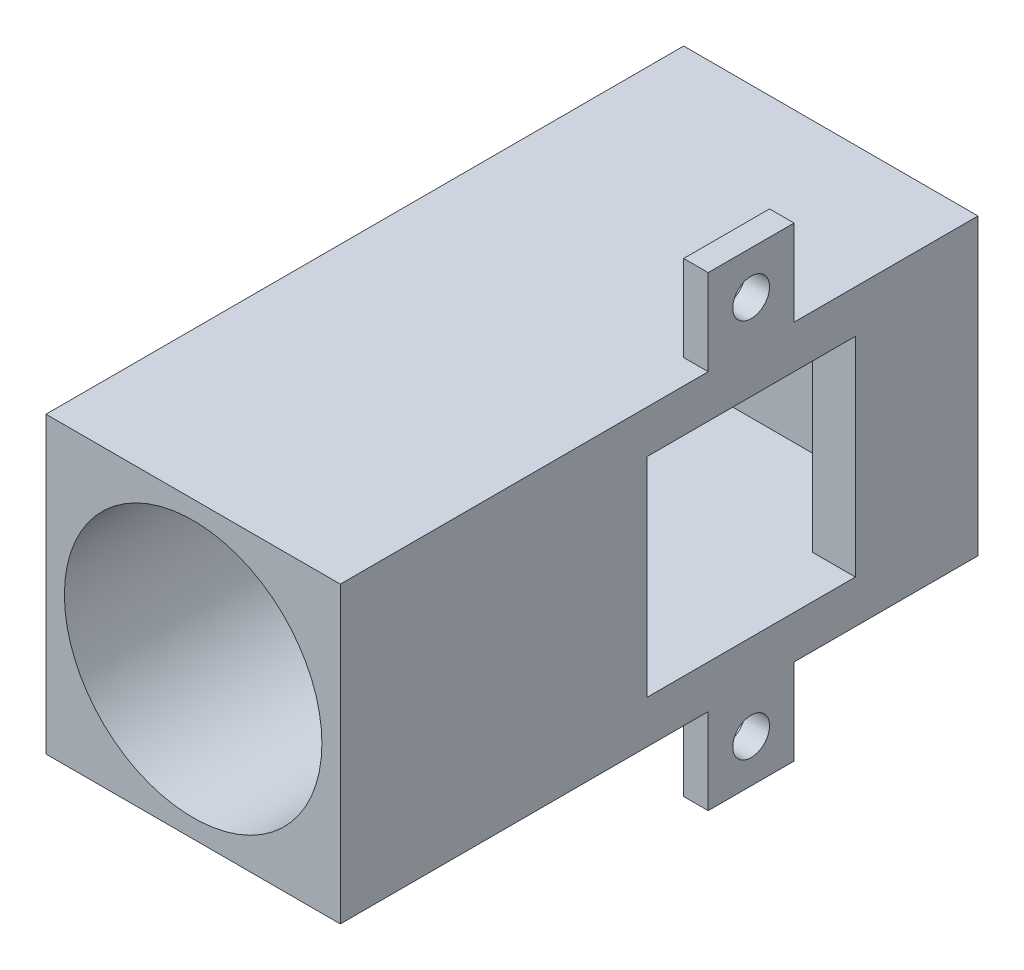
ISO-10303-21;
HEADER;
FILE_DESCRIPTION(('STEP AP214'),'2;1');
FILE_NAME('part.step','',(''),(''),'','','');
FILE_SCHEMA(('AUTOMOTIVE_DESIGN { 1 0 10303 214 1 1 1 1 }'));
ENDSEC;
DATA;
#1=APPLICATION_CONTEXT('core data for automotive mechanical design processes');
#2=APPLICATION_PROTOCOL_DEFINITION('international standard','automotive_design',2000,#1);
#3=PRODUCT_CONTEXT('',#1,'mechanical');
#4=PRODUCT('Part','Part','',(#3));
#5=PRODUCT_RELATED_PRODUCT_CATEGORY('part','',(#4));
#6=PRODUCT_DEFINITION_FORMATION('','',#4);
#7=PRODUCT_DEFINITION_CONTEXT('part definition',#1,'design');
#8=PRODUCT_DEFINITION('design','',#6,#7);
#9=PRODUCT_DEFINITION_SHAPE('','',#8);
#10=(LENGTH_UNIT() NAMED_UNIT(*) SI_UNIT(.MILLI.,.METRE.));
#11=(NAMED_UNIT(*) PLANE_ANGLE_UNIT() SI_UNIT($,.RADIAN.));
#12=(NAMED_UNIT(*) SI_UNIT($,.STERADIAN.) SOLID_ANGLE_UNIT());
#13=UNCERTAINTY_MEASURE_WITH_UNIT(LENGTH_MEASURE(1.E-05),#10,'distance_accuracy_value','');
#14=(GEOMETRIC_REPRESENTATION_CONTEXT(3) GLOBAL_UNCERTAINTY_ASSIGNED_CONTEXT((#13)) GLOBAL_UNIT_ASSIGNED_CONTEXT((#10,
#11,#12)) REPRESENTATION_CONTEXT('',''));
#15=CARTESIAN_POINT('',(0.,0.,0.));
#16=DIRECTION('',(0.,0.,1.));
#17=DIRECTION('',(1.,0.,0.));
#18=AXIS2_PLACEMENT_3D('',#15,#16,#17);
#19=CARTESIAN_POINT('',(-8.5,8.5,-7.));
#20=DIRECTION('',(-1.,0.,0.));
#21=DIRECTION('',(0.,0.,1.));
#22=AXIS2_PLACEMENT_3D('',#19,#20,#21);
#23=PLANE('',#22);
#24=DIRECTION('',(0.,0.,1.));
#25=VECTOR('',#24,1.);
#26=CARTESIAN_POINT('',(-8.5,8.5,-7.));
#27=LINE('',#26,#25);
#28=CARTESIAN_POINT('',(-8.5,8.5,-7.));
#29=VERTEX_POINT('',#28);
#30=CARTESIAN_POINT('',(-8.5,8.5,0.));
#31=VERTEX_POINT('',#30);
#32=EDGE_CURVE('E411',#29,#31,#27,.T.);
#33=ORIENTED_EDGE('',*,*,#32,.T.);
#34=DIRECTION('',(0.,-1.,0.));
#35=VECTOR('',#34,1.);
#36=CARTESIAN_POINT('',(-8.5,8.5,0.));
#37=LINE('',#36,#35);
#38=CARTESIAN_POINT('',(-8.5,-8.5,0.));
#39=VERTEX_POINT('',#38);
#40=EDGE_CURVE('E372',#31,#39,#37,.T.);
#41=ORIENTED_EDGE('',*,*,#40,.T.);
#42=DIRECTION('',(0.,0.,1.));
#43=VECTOR('',#42,1.);
#44=CARTESIAN_POINT('',(-8.5,-8.5,-7.));
#45=LINE('',#44,#43);
#46=CARTESIAN_POINT('',(-8.5,-8.5,-7.));
#47=VERTEX_POINT('',#46);
#48=EDGE_CURVE('E427',#47,#39,#45,.T.);
#49=ORIENTED_EDGE('',*,*,#48,.F.);
#50=DIRECTION('',(0.,-1.,0.));
#51=VECTOR('',#50,1.);
#52=CARTESIAN_POINT('',(-8.5,8.5,-7.));
#53=LINE('',#52,#51);
#54=EDGE_CURVE('E376',#29,#47,#53,.T.);
#55=ORIENTED_EDGE('',*,*,#54,.F.);
#56=EDGE_LOOP('',(#33,#41,#49,#55));
#57=FACE_BOUND('',#56,.T.);
#58=ADVANCED_FACE('F39',(#57),#23,.F.);
#59=CARTESIAN_POINT('',(8.5,8.5,-7.));
#60=DIRECTION('',(1.,0.,0.));
#61=DIRECTION('',(0.,1.,0.));
#62=AXIS2_PLACEMENT_3D('',#59,#60,#61);
#63=PLANE('',#62);
#64=DIRECTION('',(0.,0.,1.));
#65=VECTOR('',#64,1.);
#66=CARTESIAN_POINT('',(8.5,-8.5,-7.));
#67=LINE('',#66,#65);
#68=CARTESIAN_POINT('',(8.5,-8.5,-7.));
#69=VERTEX_POINT('',#68);
#70=CARTESIAN_POINT('',(8.5,-8.5,0.));
#71=VERTEX_POINT('',#70);
#72=EDGE_CURVE('E422',#69,#71,#67,.T.);
#73=ORIENTED_EDGE('',*,*,#72,.T.);
#74=DIRECTION('',(0.,1.,0.));
#75=VECTOR('',#74,1.);
#76=CARTESIAN_POINT('',(8.5,8.5,0.));
#77=LINE('',#76,#75);
#78=CARTESIAN_POINT('',(8.5,8.5,0.));
#79=VERTEX_POINT('',#78);
#80=EDGE_CURVE('E368',#71,#79,#77,.T.);
#81=ORIENTED_EDGE('',*,*,#80,.T.);
#82=DIRECTION('',(0.,0.,1.));
#83=VECTOR('',#82,1.);
#84=CARTESIAN_POINT('',(8.5,8.5,-7.));
#85=LINE('',#84,#83);
#86=CARTESIAN_POINT('',(8.5,8.5,-7.));
#87=VERTEX_POINT('',#86);
#88=EDGE_CURVE('E417',#87,#79,#85,.T.);
#89=ORIENTED_EDGE('',*,*,#88,.F.);
#90=DIRECTION('',(0.,1.,0.));
#91=VECTOR('',#90,1.);
#92=CARTESIAN_POINT('',(8.5,8.5,-7.));
#93=LINE('',#92,#91);
#94=EDGE_CURVE('E385',#69,#87,#93,.T.);
#95=ORIENTED_EDGE('',*,*,#94,.F.);
#96=EDGE_LOOP('',(#73,#81,#89,#95));
#97=FACE_BOUND('',#96,.T.);
#98=ADVANCED_FACE('F536',(#97),#63,.F.);
#99=CARTESIAN_POINT('',(0.,0.,22.));
#100=DIRECTION('',(0.,0.,1.));
#101=DIRECTION('',(1.,0.,0.));
#102=AXIS2_PLACEMENT_3D('',#99,#100,#101);
#103=PLANE('',#102);
#104=DIRECTION('',(0.,-1.,0.));
#105=VECTOR('',#104,1.);
#106=CARTESIAN_POINT('',(-8.5,8.5,22.));
#107=LINE('',#106,#105);
#108=CARTESIAN_POINT('',(-8.5,6.16441400296898,22.));
#109=VERTEX_POINT('',#108);
#110=CARTESIAN_POINT('',(-8.5,-6.16441400296898,22.));
#111=VERTEX_POINT('',#110);
#112=EDGE_CURVE('E11',#109,#111,#107,.T.);
#113=ORIENTED_EDGE('',*,*,#112,.F.);
#114=CARTESIAN_POINT('',(0.,0.,22.));
#115=DIRECTION('',(0.,0.,1.));
#116=DIRECTION('',(1.,0.,0.));
#117=AXIS2_PLACEMENT_3D('',#114,#115,#116);
#118=CIRCLE('',#117,10.5);
#119=EDGE_CURVE('E617',#109,#111,#118,.T.);
#120=ORIENTED_EDGE('',*,*,#119,.T.);
#121=EDGE_LOOP('',(#113,#120));
#122=FACE_BOUND('',#121,.T.);
#123=ADVANCED_FACE('F543',(#122),#103,.T.);
#124=DIRECTION('',(1.,0.,0.));
#125=VECTOR('',#124,1.);
#126=CARTESIAN_POINT('',(8.5,-8.5,22.));
#127=LINE('',#126,#125);
#128=CARTESIAN_POINT('',(-6.16441400296898,-8.5,22.));
#129=VERTEX_POINT('',#128);
#130=CARTESIAN_POINT('',(6.16441400296898,-8.5,22.));
#131=VERTEX_POINT('',#130);
#132=EDGE_CURVE('E49',#129,#131,#127,.T.);
#133=ORIENTED_EDGE('',*,*,#132,.F.);
#134=EDGE_CURVE('E626',#129,#131,#118,.T.);
#135=ORIENTED_EDGE('',*,*,#134,.T.);
#136=EDGE_LOOP('',(#133,#135));
#137=FACE_BOUND('',#136,.T.);
#138=ADVANCED_FACE('F646',(#137),#103,.T.);
#139=DIRECTION('',(0.,1.,0.));
#140=VECTOR('',#139,1.);
#141=CARTESIAN_POINT('',(8.5,8.5,22.));
#142=LINE('',#141,#140);
#143=CARTESIAN_POINT('',(8.5,-6.16441400296898,22.));
#144=VERTEX_POINT('',#143);
#145=CARTESIAN_POINT('',(8.5,6.16441400296898,22.));
#146=VERTEX_POINT('',#145);
#147=EDGE_CURVE('E407',#144,#146,#142,.T.);
#148=ORIENTED_EDGE('',*,*,#147,.F.);
#149=EDGE_CURVE('E437',#144,#146,#118,.T.);
#150=ORIENTED_EDGE('',*,*,#149,.T.);
#151=EDGE_LOOP('',(#148,#150));
#152=FACE_BOUND('',#151,.T.);
#153=ADVANCED_FACE('F640',(#152),#103,.T.);
#154=CARTESIAN_POINT('',(-12.,12.,-10.));
#155=DIRECTION('',(-1.,0.,0.));
#156=DIRECTION('',(0.,0.,1.));
#157=AXIS2_PLACEMENT_3D('',#154,#155,#156);
#158=PLANE('',#157);
#159=DIRECTION('',(0.,1.,0.));
#160=VECTOR('',#159,1.);
#161=CARTESIAN_POINT('',(-12.,8.5,0.));
#162=LINE('',#161,#160);
#163=CARTESIAN_POINT('',(-12.,-8.5,0.));
#164=VERTEX_POINT('',#163);
#165=CARTESIAN_POINT('',(-12.,8.5,0.));
#166=VERTEX_POINT('',#165);
#167=EDGE_CURVE('E313',#164,#166,#162,.T.);
#168=ORIENTED_EDGE('',*,*,#167,.T.);
#169=DIRECTION('',(0.,0.,1.));
#170=VECTOR('',#169,1.);
#171=CARTESIAN_POINT('',(-12.,8.5,17.));
#172=LINE('',#171,#170);
#173=CARTESIAN_POINT('',(-12.,8.5,17.));
#174=VERTEX_POINT('',#173);
#175=EDGE_CURVE('E317',#166,#174,#172,.T.);
#176=ORIENTED_EDGE('',*,*,#175,.T.);
#177=DIRECTION('',(0.,-1.,0.));
#178=VECTOR('',#177,1.);
#179=CARTESIAN_POINT('',(-12.,-8.5,17.));
#180=LINE('',#179,#178);
#181=CARTESIAN_POINT('',(-12.,-8.5,17.));
#182=VERTEX_POINT('',#181);
#183=EDGE_CURVE('E322',#174,#182,#180,.T.);
#184=ORIENTED_EDGE('',*,*,#183,.T.);
#185=DIRECTION('',(0.,0.,-1.));
#186=VECTOR('',#185,1.);
#187=CARTESIAN_POINT('',(-12.,-8.5,0.));
#188=LINE('',#187,#186);
#189=EDGE_CURVE('E326',#182,#164,#188,.T.);
#190=ORIENTED_EDGE('',*,*,#189,.T.);
#191=EDGE_LOOP('',(#168,#176,#184,#190));
#192=FACE_BOUND('',#191,.T.);
#193=DIRECTION('',(0.,0.,1.));
#194=VECTOR('',#193,1.);
#195=CARTESIAN_POINT('',(-12.,-12.,-10.));
#196=LINE('',#195,#194);
#197=CARTESIAN_POINT('',(-12.,-12.,-10.));
#198=VERTEX_POINT('',#197);
#199=CARTESIAN_POINT('',(-12.,-12.,42.));
#200=VERTEX_POINT('',#199);
#201=EDGE_CURVE('E43',#198,#200,#196,.T.);
#202=ORIENTED_EDGE('',*,*,#201,.T.);
#203=DIRECTION('',(0.,-1.,0.));
#204=VECTOR('',#203,1.);
#205=CARTESIAN_POINT('',(-12.,12.,42.));
#206=LINE('',#205,#204);
#207=CARTESIAN_POINT('',(-12.,12.,42.));
#208=VERTEX_POINT('',#207);
#209=EDGE_CURVE('E435',#208,#200,#206,.T.);
#210=ORIENTED_EDGE('',*,*,#209,.F.);
#211=DIRECTION('',(0.,0.,1.));
#212=VECTOR('',#211,1.);
#213=CARTESIAN_POINT('',(-12.,12.,-10.));
#214=LINE('',#213,#212);
#215=CARTESIAN_POINT('',(-12.,12.,-10.));
#216=VERTEX_POINT('',#215);
#217=EDGE_CURVE('E471',#216,#208,#214,.T.);
#218=ORIENTED_EDGE('',*,*,#217,.F.);
#219=DIRECTION('',(0.,-1.,0.));
#220=VECTOR('',#219,1.);
#221=CARTESIAN_POINT('',(-12.,12.,-10.));
#222=LINE('',#221,#220);
#223=EDGE_CURVE('E456',#216,#198,#222,.T.);
#224=ORIENTED_EDGE('',*,*,#223,.T.);
#225=EDGE_LOOP('',(#202,#210,#218,#224));
#226=FACE_BOUND('',#225,.T.);
#227=ADVANCED_FACE('F41',(#192,#226),#158,.T.);
#228=CARTESIAN_POINT('',(12.,12.,-10.));
#229=DIRECTION('',(0.,1.,0.));
#230=DIRECTION('',(-1.,0.,0.));
#231=AXIS2_PLACEMENT_3D('',#228,#229,#230);
#232=PLANE('',#231);
#233=DIRECTION('',(1.,0.,0.));
#234=VECTOR('',#233,1.);
#235=CARTESIAN_POINT('',(10.,12.,12.));
#236=LINE('',#235,#234);
#237=CARTESIAN_POINT('',(10.,12.,12.));
#238=VERTEX_POINT('',#237);
#239=CARTESIAN_POINT('',(12.,12.,12.));
#240=VERTEX_POINT('',#239);
#241=EDGE_CURVE('E308',#238,#240,#236,.T.);
#242=ORIENTED_EDGE('',*,*,#241,.F.);
#243=DIRECTION('',(0.,0.,-1.));
#244=VECTOR('',#243,1.);
#245=CARTESIAN_POINT('',(10.,12.,5.00000000000001));
#246=LINE('',#245,#244);
#247=CARTESIAN_POINT('',(10.,12.,5.00000000000001));
#248=VERTEX_POINT('',#247);
#249=EDGE_CURVE('E283',#238,#248,#246,.T.);
#250=ORIENTED_EDGE('',*,*,#249,.T.);
#251=DIRECTION('',(1.,0.,0.));
#252=VECTOR('',#251,1.);
#253=CARTESIAN_POINT('',(10.,12.,5.00000000000001));
#254=LINE('',#253,#252);
#255=CARTESIAN_POINT('',(12.,12.,5.00000000000001));
#256=VERTEX_POINT('',#255);
#257=EDGE_CURVE('E305',#248,#256,#254,.T.);
#258=ORIENTED_EDGE('',*,*,#257,.T.);
#259=DIRECTION('',(0.,0.,1.));
#260=VECTOR('',#259,1.);
#261=CARTESIAN_POINT('',(12.,12.,-10.));
#262=LINE('',#261,#260);
#263=CARTESIAN_POINT('',(12.,12.,-10.));
#264=VERTEX_POINT('',#263);
#265=EDGE_CURVE('E474',#264,#256,#262,.T.);
#266=ORIENTED_EDGE('',*,*,#265,.F.);
#267=DIRECTION('',(-1.,0.,0.));
#268=VECTOR('',#267,1.);
#269=CARTESIAN_POINT('',(12.,12.,-10.));
#270=LINE('',#269,#268);
#271=EDGE_CURVE('E467',#264,#216,#270,.T.);
#272=ORIENTED_EDGE('',*,*,#271,.T.);
#273=ORIENTED_EDGE('',*,*,#217,.T.);
#274=DIRECTION('',(-1.,0.,0.));
#275=VECTOR('',#274,1.);
#276=CARTESIAN_POINT('',(12.,12.,42.));
#277=LINE('',#276,#275);
#278=CARTESIAN_POINT('',(12.,12.,42.));
#279=VERTEX_POINT('',#278);
#280=EDGE_CURVE('E452',#279,#208,#277,.T.);
#281=ORIENTED_EDGE('',*,*,#280,.F.);
#282=EDGE_CURVE('E477',#240,#279,#262,.T.);
#283=ORIENTED_EDGE('',*,*,#282,.F.);
#284=EDGE_LOOP('',(#242,#250,#258,#266,#272,#273,#281,#283));
#285=FACE_BOUND('',#284,.T.);
#286=ADVANCED_FACE('F496',(#285),#232,.T.);
#287=CARTESIAN_POINT('',(12.,-12.,-10.));
#288=DIRECTION('',(1.,0.,0.));
#289=DIRECTION('',(0.,0.,-1.));
#290=AXIS2_PLACEMENT_3D('',#287,#288,#289);
#291=PLANE('',#290);
#292=DIRECTION('',(0.,1.,0.));
#293=VECTOR('',#292,1.);
#294=CARTESIAN_POINT('',(12.,8.5,0.));
#295=LINE('',#294,#293);
#296=CARTESIAN_POINT('',(12.,-8.5,0.));
#297=VERTEX_POINT('',#296);
#298=CARTESIAN_POINT('',(12.,8.5,0.));
#299=VERTEX_POINT('',#298);
#300=EDGE_CURVE('E304',#297,#299,#295,.T.);
#301=ORIENTED_EDGE('',*,*,#300,.F.);
#302=DIRECTION('',(0.,0.,-1.));
#303=VECTOR('',#302,1.);
#304=CARTESIAN_POINT('',(12.,-8.5,0.));
#305=LINE('',#304,#303);
#306=CARTESIAN_POINT('',(12.,-8.5,17.));
#307=VERTEX_POINT('',#306);
#308=EDGE_CURVE('E318',#307,#297,#305,.T.);
#309=ORIENTED_EDGE('',*,*,#308,.F.);
#310=DIRECTION('',(0.,-1.,0.));
#311=VECTOR('',#310,1.);
#312=CARTESIAN_POINT('',(12.,-8.5,17.));
#313=LINE('',#312,#311);
#314=CARTESIAN_POINT('',(12.,8.5,17.));
#315=VERTEX_POINT('',#314);
#316=EDGE_CURVE('E337',#315,#307,#313,.T.);
#317=ORIENTED_EDGE('',*,*,#316,.F.);
#318=DIRECTION('',(0.,0.,1.));
#319=VECTOR('',#318,1.);
#320=CARTESIAN_POINT('',(12.,8.5,17.));
#321=LINE('',#320,#319);
#322=EDGE_CURVE('E333',#299,#315,#321,.T.);
#323=ORIENTED_EDGE('',*,*,#322,.F.);
#324=EDGE_LOOP('',(#301,#309,#317,#323));
#325=FACE_BOUND('',#324,.T.);
#326=ORIENTED_EDGE('',*,*,#265,.T.);
#327=DIRECTION('',(0.,1.,0.));
#328=VECTOR('',#327,1.);
#329=CARTESIAN_POINT('',(12.,12.,5.00000000000001));
#330=LINE('',#329,#328);
#331=CARTESIAN_POINT('',(12.,19.,5.00000000000001));
#332=VERTEX_POINT('',#331);
#333=EDGE_CURVE('E67',#256,#332,#330,.T.);
#334=ORIENTED_EDGE('',*,*,#333,.T.);
#335=DIRECTION('',(0.,0.,1.));
#336=VECTOR('',#335,1.);
#337=CARTESIAN_POINT('',(12.,19.,5.00000000000001));
#338=LINE('',#337,#336);
#339=CARTESIAN_POINT('',(12.,19.,12.));
#340=VERTEX_POINT('',#339);
#341=EDGE_CURVE('E270',#332,#340,#338,.T.);
#342=ORIENTED_EDGE('',*,*,#341,.T.);
#343=DIRECTION('',(0.,-1.,0.));
#344=VECTOR('',#343,1.);
#345=CARTESIAN_POINT('',(12.,19.,12.));
#346=LINE('',#345,#344);
#347=EDGE_CURVE('E295',#340,#240,#346,.T.);
#348=ORIENTED_EDGE('',*,*,#347,.T.);
#349=ORIENTED_EDGE('',*,*,#282,.T.);
#350=DIRECTION('',(0.,1.,0.));
#351=VECTOR('',#350,1.);
#352=CARTESIAN_POINT('',(12.,-12.,42.));
#353=LINE('',#352,#351);
#354=CARTESIAN_POINT('',(12.,-12.,42.));
#355=VERTEX_POINT('',#354);
#356=EDGE_CURVE('E448',#355,#279,#353,.T.);
#357=ORIENTED_EDGE('',*,*,#356,.F.);
#358=DIRECTION('',(0.,0.,1.));
#359=VECTOR('',#358,1.);
#360=CARTESIAN_POINT('',(12.,-12.,-10.));
#361=LINE('',#360,#359);
#362=CARTESIAN_POINT('',(12.,-12.,12.));
#363=VERTEX_POINT('',#362);
#364=EDGE_CURVE('E479',#363,#355,#361,.T.);
#365=ORIENTED_EDGE('',*,*,#364,.F.);
#366=DIRECTION('',(0.,-1.,0.));
#367=VECTOR('',#366,1.);
#368=CARTESIAN_POINT('',(12.,-12.,12.));
#369=LINE('',#368,#367);
#370=CARTESIAN_POINT('',(12.,-19.,12.));
#371=VERTEX_POINT('',#370);
#372=EDGE_CURVE('E59',#363,#371,#369,.T.);
#373=ORIENTED_EDGE('',*,*,#372,.T.);
#374=DIRECTION('',(0.,0.,-1.));
#375=VECTOR('',#374,1.);
#376=CARTESIAN_POINT('',(12.,-19.,12.));
#377=LINE('',#376,#375);
#378=CARTESIAN_POINT('',(12.,-19.,5.00000000000001));
#379=VERTEX_POINT('',#378);
#380=EDGE_CURVE('E249',#371,#379,#377,.T.);
#381=ORIENTED_EDGE('',*,*,#380,.T.);
#382=DIRECTION('',(0.,1.,0.));
#383=VECTOR('',#382,1.);
#384=CARTESIAN_POINT('',(12.,-19.,5.00000000000001));
#385=LINE('',#384,#383);
#386=CARTESIAN_POINT('',(12.,-12.,5.00000000000001));
#387=VERTEX_POINT('',#386);
#388=EDGE_CURVE('E505',#379,#387,#385,.T.);
#389=ORIENTED_EDGE('',*,*,#388,.T.);
#390=CARTESIAN_POINT('',(12.,-12.,-10.));
#391=VERTEX_POINT('',#390);
#392=EDGE_CURVE('E254',#391,#387,#361,.T.);
#393=ORIENTED_EDGE('',*,*,#392,.F.);
#394=DIRECTION('',(0.,1.,0.));
#395=VECTOR('',#394,1.);
#396=CARTESIAN_POINT('',(12.,-12.,-10.));
#397=LINE('',#396,#395);
#398=EDGE_CURVE('E463',#391,#264,#397,.T.);
#399=ORIENTED_EDGE('',*,*,#398,.T.);
#400=EDGE_LOOP('',(#326,#334,#342,#348,#349,#357,#365,#373,#381,#389,#393,#399));
#401=FACE_BOUND('',#400,.T.);
#402=CARTESIAN_POINT('',(12.,15.5,8.5));
#403=DIRECTION('',(1.,0.,0.));
#404=DIRECTION('',(0.,0.,-1.));
#405=AXIS2_PLACEMENT_3D('',#402,#403,#404);
#406=CIRCLE('',#405,1.5);
#407=CARTESIAN_POINT('',(12.,15.5,7.));
#408=VERTEX_POINT('',#407);
#409=EDGE_CURVE('E271',#408,#408,#406,.T.);
#410=ORIENTED_EDGE('',*,*,#409,.F.);
#411=EDGE_LOOP('',(#410));
#412=FACE_BOUND('',#411,.T.);
#413=CARTESIAN_POINT('',(12.,-15.5,8.5));
#414=DIRECTION('',(1.,0.,0.));
#415=DIRECTION('',(0.,0.,-1.));
#416=AXIS2_PLACEMENT_3D('',#413,#414,#415);
#417=CIRCLE('',#416,1.5);
#418=CARTESIAN_POINT('',(12.,-15.5,7.));
#419=VERTEX_POINT('',#418);
#420=EDGE_CURVE('E514',#419,#419,#417,.T.);
#421=ORIENTED_EDGE('',*,*,#420,.F.);
#422=EDGE_LOOP('',(#421));
#423=FACE_BOUND('',#422,.T.);
#424=ADVANCED_FACE('F502',(#325,#401,#412,#423),#291,.T.);
#425=CARTESIAN_POINT('',(-12.,-12.,-10.));
#426=DIRECTION('',(0.,-1.,0.));
#427=DIRECTION('',(0.,0.,-1.));
#428=AXIS2_PLACEMENT_3D('',#425,#426,#427);
#429=PLANE('',#428);
#430=DIRECTION('',(1.,0.,0.));
#431=VECTOR('',#430,1.);
#432=CARTESIAN_POINT('',(10.,-12.,5.00000000000001));
#433=LINE('',#432,#431);
#434=CARTESIAN_POINT('',(10.,-12.,5.00000000000001));
#435=VERTEX_POINT('',#434);
#436=EDGE_CURVE('E245',#435,#387,#433,.T.);
#437=ORIENTED_EDGE('',*,*,#436,.F.);
#438=DIRECTION('',(0.,0.,1.));
#439=VECTOR('',#438,1.);
#440=CARTESIAN_POINT('',(10.,-12.,5.00000000000001));
#441=LINE('',#440,#439);
#442=CARTESIAN_POINT('',(10.,-12.,12.));
#443=VERTEX_POINT('',#442);
#444=EDGE_CURVE('E230',#435,#443,#441,.T.);
#445=ORIENTED_EDGE('',*,*,#444,.T.);
#446=DIRECTION('',(1.,0.,0.));
#447=VECTOR('',#446,1.);
#448=CARTESIAN_POINT('',(10.,-12.,12.));
#449=LINE('',#448,#447);
#450=EDGE_CURVE('E256',#443,#363,#449,.T.);
#451=ORIENTED_EDGE('',*,*,#450,.T.);
#452=ORIENTED_EDGE('',*,*,#364,.T.);
#453=DIRECTION('',(1.,0.,0.));
#454=VECTOR('',#453,1.);
#455=CARTESIAN_POINT('',(-12.,-12.,42.));
#456=LINE('',#455,#454);
#457=EDGE_CURVE('E444',#200,#355,#456,.T.);
#458=ORIENTED_EDGE('',*,*,#457,.F.);
#459=ORIENTED_EDGE('',*,*,#201,.F.);
#460=DIRECTION('',(1.,0.,0.));
#461=VECTOR('',#460,1.);
#462=CARTESIAN_POINT('',(-12.,-12.,-10.));
#463=LINE('',#462,#461);
#464=EDGE_CURVE('E460',#198,#391,#463,.T.);
#465=ORIENTED_EDGE('',*,*,#464,.T.);
#466=ORIENTED_EDGE('',*,*,#392,.T.);
#467=EDGE_LOOP('',(#437,#445,#451,#452,#458,#459,#465,#466));
#468=FACE_BOUND('',#467,.T.);
#469=ADVANCED_FACE('F252',(#468),#429,.T.);
#470=CARTESIAN_POINT('',(0.,0.,-10.));
#471=DIRECTION('',(0.,0.,1.));
#472=DIRECTION('',(1.,0.,0.));
#473=AXIS2_PLACEMENT_3D('',#470,#471,#472);
#474=PLANE('',#473);
#475=ORIENTED_EDGE('',*,*,#223,.F.);
#476=ORIENTED_EDGE('',*,*,#271,.F.);
#477=ORIENTED_EDGE('',*,*,#398,.F.);
#478=ORIENTED_EDGE('',*,*,#464,.F.);
#479=EDGE_LOOP('',(#475,#476,#477,#478));
#480=FACE_BOUND('',#479,.T.);
#481=ADVANCED_FACE('F499',(#480),#474,.F.);
#482=CARTESIAN_POINT('',(0.,0.,42.));
#483=DIRECTION('',(0.,0.,1.));
#484=DIRECTION('',(1.,0.,0.));
#485=AXIS2_PLACEMENT_3D('',#482,#483,#484);
#486=PLANE('',#485);
#487=CARTESIAN_POINT('',(0.,0.,42.));
#488=DIRECTION('',(0.,0.,1.));
#489=DIRECTION('',(1.,0.,0.));
#490=AXIS2_PLACEMENT_3D('',#487,#488,#489);
#491=CIRCLE('',#490,10.5);
#492=CARTESIAN_POINT('',(10.5,0.,42.));
#493=VERTEX_POINT('',#492);
#494=EDGE_CURVE('E415',#493,#493,#491,.T.);
#495=ORIENTED_EDGE('',*,*,#494,.F.);
#496=EDGE_LOOP('',(#495));
#497=FACE_BOUND('',#496,.T.);
#498=ORIENTED_EDGE('',*,*,#209,.T.);
#499=ORIENTED_EDGE('',*,*,#457,.T.);
#500=ORIENTED_EDGE('',*,*,#356,.T.);
#501=ORIENTED_EDGE('',*,*,#280,.T.);
#502=EDGE_LOOP('',(#498,#499,#500,#501));
#503=FACE_BOUND('',#502,.T.);
#504=ADVANCED_FACE('F491',(#497,#503),#486,.T.);
#505=CARTESIAN_POINT('',(0.,0.,22.));
#506=DIRECTION('',(0.,0.,1.));
#507=DIRECTION('',(1.,0.,0.));
#508=AXIS2_PLACEMENT_3D('',#505,#506,#507);
#509=CYLINDRICAL_SURFACE('',#508,10.5);
#510=CARTESIAN_POINT('',(6.16441400296898,8.5,22.));
#511=VERTEX_POINT('',#510);
#512=EDGE_CURVE('E431',#146,#511,#118,.T.);
#513=ORIENTED_EDGE('',*,*,#512,.F.);
#514=ORIENTED_EDGE('',*,*,#149,.F.);
#515=EDGE_CURVE('E631',#131,#144,#118,.T.);
#516=ORIENTED_EDGE('',*,*,#515,.F.);
#517=ORIENTED_EDGE('',*,*,#134,.F.);
#518=EDGE_CURVE('E622',#111,#129,#118,.T.);
#519=ORIENTED_EDGE('',*,*,#518,.F.);
#520=ORIENTED_EDGE('',*,*,#119,.F.);
#521=CARTESIAN_POINT('',(-6.16441400296898,8.5,22.));
#522=VERTEX_POINT('',#521);
#523=EDGE_CURVE('E614',#522,#109,#118,.T.);
#524=ORIENTED_EDGE('',*,*,#523,.F.);
#525=EDGE_CURVE('E436',#511,#522,#118,.T.);
#526=ORIENTED_EDGE('',*,*,#525,.F.);
#527=EDGE_LOOP('',(#513,#514,#516,#517,#519,#520,#524,#526));
#528=FACE_BOUND('',#527,.T.);
#529=ORIENTED_EDGE('',*,*,#494,.T.);
#530=EDGE_LOOP('',(#529));
#531=FACE_BOUND('',#530,.T.);
#532=ADVANCED_FACE('F611',(#528,#531),#509,.F.);
#533=DIRECTION('',(-1.,0.,0.));
#534=VECTOR('',#533,1.);
#535=CARTESIAN_POINT('',(8.5,8.5,22.));
#536=LINE('',#535,#534);
#537=EDGE_CURVE('E410',#511,#522,#536,.T.);
#538=ORIENTED_EDGE('',*,*,#537,.F.);
#539=ORIENTED_EDGE('',*,*,#525,.T.);
#540=EDGE_LOOP('',(#538,#539));
#541=FACE_BOUND('',#540,.T.);
#542=ADVANCED_FACE('F608',(#541),#103,.T.);
#543=CARTESIAN_POINT('',(0.,0.,22.));
#544=DIRECTION('',(0.,0.,-1.));
#545=DIRECTION('',(-1.,0.,0.));
#546=AXIS2_PLACEMENT_3D('',#543,#544,#545);
#547=PLANE('',#546);
#548=ORIENTED_EDGE('',*,*,#512,.T.);
#549=CARTESIAN_POINT('',(8.5,8.5,22.));
#550=VERTEX_POINT('',#549);
#551=EDGE_CURVE('E381',#550,#511,#536,.T.);
#552=ORIENTED_EDGE('',*,*,#551,.F.);
#553=EDGE_CURVE('E401',#146,#550,#142,.T.);
#554=ORIENTED_EDGE('',*,*,#553,.F.);
#555=EDGE_LOOP('',(#548,#552,#554));
#556=FACE_BOUND('',#555,.T.);
#557=ADVANCED_FACE('F562',(#556),#547,.T.);
#558=ORIENTED_EDGE('',*,*,#523,.T.);
#559=CARTESIAN_POINT('',(-8.5,8.5,22.));
#560=VERTEX_POINT('',#559);
#561=EDGE_CURVE('E51',#560,#109,#107,.T.);
#562=ORIENTED_EDGE('',*,*,#561,.F.);
#563=EDGE_CURVE('E406',#522,#560,#536,.T.);
#564=ORIENTED_EDGE('',*,*,#563,.F.);
#565=EDGE_LOOP('',(#558,#562,#564));
#566=FACE_BOUND('',#565,.T.);
#567=ADVANCED_FACE('F694',(#566),#547,.T.);
#568=ORIENTED_EDGE('',*,*,#518,.T.);
#569=CARTESIAN_POINT('',(-8.5,-8.5,22.));
#570=VERTEX_POINT('',#569);
#571=EDGE_CURVE('E397',#570,#129,#127,.T.);
#572=ORIENTED_EDGE('',*,*,#571,.F.);
#573=EDGE_CURVE('E52',#111,#570,#107,.T.);
#574=ORIENTED_EDGE('',*,*,#573,.F.);
#575=EDGE_LOOP('',(#568,#572,#574));
#576=FACE_BOUND('',#575,.T.);
#577=ADVANCED_FACE('F559',(#576),#547,.T.);
#578=ORIENTED_EDGE('',*,*,#515,.T.);
#579=CARTESIAN_POINT('',(8.5,-8.5,22.));
#580=VERTEX_POINT('',#579);
#581=EDGE_CURVE('E402',#580,#144,#142,.T.);
#582=ORIENTED_EDGE('',*,*,#581,.F.);
#583=EDGE_CURVE('E396',#131,#580,#127,.T.);
#584=ORIENTED_EDGE('',*,*,#583,.F.);
#585=EDGE_LOOP('',(#578,#582,#584));
#586=FACE_BOUND('',#585,.T.);
#587=ADVANCED_FACE('F551',(#586),#547,.T.);
#588=CARTESIAN_POINT('',(-8.5,-8.5,17.));
#589=VERTEX_POINT('',#588);
#590=EDGE_CURVE('E392',#589,#570,#45,.T.);
#591=ORIENTED_EDGE('',*,*,#590,.F.);
#592=DIRECTION('',(0.,1.,0.));
#593=VECTOR('',#592,1.);
#594=CARTESIAN_POINT('',(-8.5,8.5,17.));
#595=LINE('',#594,#593);
#596=CARTESIAN_POINT('',(-8.5,8.5,17.));
#597=VERTEX_POINT('',#596);
#598=EDGE_CURVE('E364',#589,#597,#595,.T.);
#599=ORIENTED_EDGE('',*,*,#598,.T.);
#600=EDGE_CURVE('E416',#597,#560,#27,.T.);
#601=ORIENTED_EDGE('',*,*,#600,.T.);
#602=ORIENTED_EDGE('',*,*,#561,.T.);
#603=ORIENTED_EDGE('',*,*,#112,.T.);
#604=ORIENTED_EDGE('',*,*,#573,.T.);
#605=EDGE_LOOP('',(#591,#599,#601,#602,#603,#604));
#606=FACE_BOUND('',#605,.T.);
#607=ADVANCED_FACE('F539',(#606),#23,.F.);
#608=CARTESIAN_POINT('',(8.5,8.5,-7.));
#609=DIRECTION('',(0.,1.,0.));
#610=DIRECTION('',(-1.,0.,0.));
#611=AXIS2_PLACEMENT_3D('',#608,#609,#610);
#612=PLANE('',#611);
#613=ORIENTED_EDGE('',*,*,#600,.F.);
#614=DIRECTION('',(1.,0.,0.));
#615=VECTOR('',#614,1.);
#616=CARTESIAN_POINT('',(-12.,8.5,17.));
#617=LINE('',#616,#615);
#618=EDGE_CURVE('E354',#174,#597,#617,.T.);
#619=ORIENTED_EDGE('',*,*,#618,.F.);
#620=ORIENTED_EDGE('',*,*,#175,.F.);
#621=DIRECTION('',(1.,0.,0.));
#622=VECTOR('',#621,1.);
#623=CARTESIAN_POINT('',(-12.,8.5,0.));
#624=LINE('',#623,#622);
#625=EDGE_CURVE('E358',#166,#31,#624,.T.);
#626=ORIENTED_EDGE('',*,*,#625,.T.);
#627=ORIENTED_EDGE('',*,*,#32,.F.);
#628=DIRECTION('',(-1.,0.,0.));
#629=VECTOR('',#628,1.);
#630=CARTESIAN_POINT('',(8.5,8.5,-7.));
#631=LINE('',#630,#629);
#632=EDGE_CURVE('E389',#87,#29,#631,.T.);
#633=ORIENTED_EDGE('',*,*,#632,.F.);
#634=ORIENTED_EDGE('',*,*,#88,.T.);
#635=EDGE_CURVE('E330',#79,#299,#624,.T.);
#636=ORIENTED_EDGE('',*,*,#635,.T.);
#637=ORIENTED_EDGE('',*,*,#322,.T.);
#638=CARTESIAN_POINT('',(8.5,8.5,17.));
#639=VERTEX_POINT('',#638);
#640=EDGE_CURVE('E357',#639,#315,#617,.T.);
#641=ORIENTED_EDGE('',*,*,#640,.F.);
#642=EDGE_CURVE('E421',#639,#550,#85,.T.);
#643=ORIENTED_EDGE('',*,*,#642,.T.);
#644=ORIENTED_EDGE('',*,*,#551,.T.);
#645=ORIENTED_EDGE('',*,*,#537,.T.);
#646=ORIENTED_EDGE('',*,*,#563,.T.);
#647=EDGE_LOOP('',(#613,#619,#620,#626,#627,#633,#634,#636,#637,#641,#643,#644,#645,#646));
#648=FACE_BOUND('',#647,.T.);
#649=ADVANCED_FACE('F550',(#648),#612,.F.);
#650=ORIENTED_EDGE('',*,*,#642,.F.);
#651=DIRECTION('',(0.,-1.,0.));
#652=VECTOR('',#651,1.);
#653=CARTESIAN_POINT('',(8.5,8.5,17.));
#654=LINE('',#653,#652);
#655=CARTESIAN_POINT('',(8.5,-8.5,17.));
#656=VERTEX_POINT('',#655);
#657=EDGE_CURVE('E347',#639,#656,#654,.T.);
#658=ORIENTED_EDGE('',*,*,#657,.T.);
#659=EDGE_CURVE('E426',#656,#580,#67,.T.);
#660=ORIENTED_EDGE('',*,*,#659,.T.);
#661=ORIENTED_EDGE('',*,*,#581,.T.);
#662=ORIENTED_EDGE('',*,*,#147,.T.);
#663=ORIENTED_EDGE('',*,*,#553,.T.);
#664=EDGE_LOOP('',(#650,#658,#660,#661,#662,#663));
#665=FACE_BOUND('',#664,.T.);
#666=ADVANCED_FACE('F546',(#665),#63,.F.);
#667=CARTESIAN_POINT('',(8.5,-8.5,-7.));
#668=DIRECTION('',(0.,-1.,0.));
#669=DIRECTION('',(1.,0.,0.));
#670=AXIS2_PLACEMENT_3D('',#667,#668,#669);
#671=PLANE('',#670);
#672=ORIENTED_EDGE('',*,*,#659,.F.);
#673=DIRECTION('',(1.,0.,0.));
#674=VECTOR('',#673,1.);
#675=CARTESIAN_POINT('',(-12.,-8.5,17.));
#676=LINE('',#675,#674);
#677=EDGE_CURVE('E353',#656,#307,#676,.T.);
#678=ORIENTED_EDGE('',*,*,#677,.T.);
#679=ORIENTED_EDGE('',*,*,#308,.T.);
#680=DIRECTION('',(1.,0.,0.));
#681=VECTOR('',#680,1.);
#682=CARTESIAN_POINT('',(-12.,-8.5,0.));
#683=LINE('',#682,#681);
#684=EDGE_CURVE('E348',#71,#297,#683,.T.);
#685=ORIENTED_EDGE('',*,*,#684,.F.);
#686=ORIENTED_EDGE('',*,*,#72,.F.);
#687=DIRECTION('',(1.,0.,0.));
#688=VECTOR('',#687,1.);
#689=CARTESIAN_POINT('',(8.5,-8.5,-7.));
#690=LINE('',#689,#688);
#691=EDGE_CURVE('E380',#47,#69,#690,.T.);
#692=ORIENTED_EDGE('',*,*,#691,.F.);
#693=ORIENTED_EDGE('',*,*,#48,.T.);
#694=EDGE_CURVE('E344',#164,#39,#683,.T.);
#695=ORIENTED_EDGE('',*,*,#694,.F.);
#696=ORIENTED_EDGE('',*,*,#189,.F.);
#697=EDGE_CURVE('E349',#182,#589,#676,.T.);
#698=ORIENTED_EDGE('',*,*,#697,.T.);
#699=ORIENTED_EDGE('',*,*,#590,.T.);
#700=ORIENTED_EDGE('',*,*,#571,.T.);
#701=ORIENTED_EDGE('',*,*,#132,.T.);
#702=ORIENTED_EDGE('',*,*,#583,.T.);
#703=EDGE_LOOP('',(#672,#678,#679,#685,#686,#692,#693,#695,#696,#698,#699,#700,#701,#702));
#704=FACE_BOUND('',#703,.T.);
#705=ADVANCED_FACE('F645',(#704),#671,.F.);
#706=CARTESIAN_POINT('',(0.,0.,-7.));
#707=DIRECTION('',(0.,0.,-1.));
#708=DIRECTION('',(-1.,0.,0.));
#709=AXIS2_PLACEMENT_3D('',#706,#707,#708);
#710=PLANE('',#709);
#711=ORIENTED_EDGE('',*,*,#54,.T.);
#712=ORIENTED_EDGE('',*,*,#691,.T.);
#713=ORIENTED_EDGE('',*,*,#94,.T.);
#714=ORIENTED_EDGE('',*,*,#632,.T.);
#715=EDGE_LOOP('',(#711,#712,#713,#714));
#716=FACE_BOUND('',#715,.T.);
#717=ADVANCED_FACE('F714',(#716),#710,.F.);
#718=CARTESIAN_POINT('',(-12.,-8.5,17.));
#719=DIRECTION('',(0.,0.,1.));
#720=DIRECTION('',(1.,0.,0.));
#721=AXIS2_PLACEMENT_3D('',#718,#719,#720);
#722=PLANE('',#721);
#723=ORIENTED_EDGE('',*,*,#640,.T.);
#724=ORIENTED_EDGE('',*,*,#316,.T.);
#725=ORIENTED_EDGE('',*,*,#677,.F.);
#726=ORIENTED_EDGE('',*,*,#657,.F.);
#727=EDGE_LOOP('',(#723,#724,#725,#726));
#728=FACE_BOUND('',#727,.T.);
#729=ADVANCED_FACE('F590',(#728),#722,.F.);
#730=CARTESIAN_POINT('',(-12.,8.5,0.));
#731=DIRECTION('',(0.,0.,-1.));
#732=DIRECTION('',(0.,1.,0.));
#733=AXIS2_PLACEMENT_3D('',#730,#731,#732);
#734=PLANE('',#733);
#735=ORIENTED_EDGE('',*,*,#684,.T.);
#736=ORIENTED_EDGE('',*,*,#300,.T.);
#737=ORIENTED_EDGE('',*,*,#635,.F.);
#738=ORIENTED_EDGE('',*,*,#80,.F.);
#739=EDGE_LOOP('',(#735,#736,#737,#738));
#740=FACE_BOUND('',#739,.T.);
#741=ADVANCED_FACE('F772',(#740),#734,.F.);
#742=ORIENTED_EDGE('',*,*,#625,.F.);
#743=ORIENTED_EDGE('',*,*,#167,.F.);
#744=ORIENTED_EDGE('',*,*,#694,.T.);
#745=ORIENTED_EDGE('',*,*,#40,.F.);
#746=EDGE_LOOP('',(#742,#743,#744,#745));
#747=FACE_BOUND('',#746,.T.);
#748=ADVANCED_FACE('F782',(#747),#734,.F.);
#749=ORIENTED_EDGE('',*,*,#697,.F.);
#750=ORIENTED_EDGE('',*,*,#183,.F.);
#751=ORIENTED_EDGE('',*,*,#618,.T.);
#752=ORIENTED_EDGE('',*,*,#598,.F.);
#753=EDGE_LOOP('',(#749,#750,#751,#752));
#754=FACE_BOUND('',#753,.T.);
#755=ADVANCED_FACE('F774',(#754),#722,.F.);
#756=CARTESIAN_POINT('',(10.,19.,5.00000000000001));
#757=DIRECTION('',(0.,1.,0.));
#758=DIRECTION('',(0.,0.,1.));
#759=AXIS2_PLACEMENT_3D('',#756,#757,#758);
#760=PLANE('',#759);
#761=ORIENTED_EDGE('',*,*,#341,.F.);
#762=DIRECTION('',(1.,0.,0.));
#763=VECTOR('',#762,1.);
#764=CARTESIAN_POINT('',(10.,19.,5.00000000000001));
#765=LINE('',#764,#763);
#766=CARTESIAN_POINT('',(10.,19.,5.00000000000001));
#767=VERTEX_POINT('',#766);
#768=EDGE_CURVE('E301',#767,#332,#765,.T.);
#769=ORIENTED_EDGE('',*,*,#768,.F.);
#770=DIRECTION('',(0.,0.,1.));
#771=VECTOR('',#770,1.);
#772=CARTESIAN_POINT('',(10.,19.,5.00000000000001));
#773=LINE('',#772,#771);
#774=CARTESIAN_POINT('',(10.,19.,12.));
#775=VERTEX_POINT('',#774);
#776=EDGE_CURVE('E275',#767,#775,#773,.T.);
#777=ORIENTED_EDGE('',*,*,#776,.T.);
#778=DIRECTION('',(1.,0.,0.));
#779=VECTOR('',#778,1.);
#780=CARTESIAN_POINT('',(10.,19.,12.));
#781=LINE('',#780,#779);
#782=EDGE_CURVE('E291',#775,#340,#781,.T.);
#783=ORIENTED_EDGE('',*,*,#782,.T.);
#784=EDGE_LOOP('',(#761,#769,#777,#783));
#785=FACE_BOUND('',#784,.T.);
#786=ADVANCED_FACE('F799',(#785),#760,.T.);
#787=CARTESIAN_POINT('',(10.,12.,5.00000000000001));
#788=DIRECTION('',(0.,0.,-1.));
#789=DIRECTION('',(-1.,0.,0.));
#790=AXIS2_PLACEMENT_3D('',#787,#788,#789);
#791=PLANE('',#790);
#792=ORIENTED_EDGE('',*,*,#333,.F.);
#793=ORIENTED_EDGE('',*,*,#257,.F.);
#794=DIRECTION('',(0.,1.,0.));
#795=VECTOR('',#794,1.);
#796=CARTESIAN_POINT('',(10.,12.,5.00000000000001));
#797=LINE('',#796,#795);
#798=EDGE_CURVE('E287',#248,#767,#797,.T.);
#799=ORIENTED_EDGE('',*,*,#798,.T.);
#800=ORIENTED_EDGE('',*,*,#768,.T.);
#801=EDGE_LOOP('',(#792,#793,#799,#800));
#802=FACE_BOUND('',#801,.T.);
#803=ADVANCED_FACE('F821',(#802),#791,.T.);
#804=CARTESIAN_POINT('',(10.,19.,12.));
#805=DIRECTION('',(0.,0.,1.));
#806=DIRECTION('',(0.,-1.,0.));
#807=AXIS2_PLACEMENT_3D('',#804,#805,#806);
#808=PLANE('',#807);
#809=ORIENTED_EDGE('',*,*,#347,.F.);
#810=ORIENTED_EDGE('',*,*,#782,.F.);
#811=DIRECTION('',(0.,-1.,0.));
#812=VECTOR('',#811,1.);
#813=CARTESIAN_POINT('',(10.,19.,12.));
#814=LINE('',#813,#812);
#815=EDGE_CURVE('E279',#775,#238,#814,.T.);
#816=ORIENTED_EDGE('',*,*,#815,.T.);
#817=ORIENTED_EDGE('',*,*,#241,.T.);
#818=EDGE_LOOP('',(#809,#810,#816,#817));
#819=FACE_BOUND('',#818,.T.);
#820=ADVANCED_FACE('F830',(#819),#808,.T.);
#821=CARTESIAN_POINT('',(10.,0.,0.));
#822=DIRECTION('',(1.,0.,0.));
#823=DIRECTION('',(0.,0.,-1.));
#824=AXIS2_PLACEMENT_3D('',#821,#822,#823);
#825=PLANE('',#824);
#826=CARTESIAN_POINT('',(10.,15.5,8.5));
#827=DIRECTION('',(1.,0.,0.));
#828=DIRECTION('',(0.,0.,-1.));
#829=AXIS2_PLACEMENT_3D('',#826,#827,#828);
#830=CIRCLE('',#829,1.5);
#831=CARTESIAN_POINT('',(10.,15.5,7.));
#832=VERTEX_POINT('',#831);
#833=EDGE_CURVE('E266',#832,#832,#830,.T.);
#834=ORIENTED_EDGE('',*,*,#833,.T.);
#835=EDGE_LOOP('',(#834));
#836=FACE_BOUND('',#835,.T.);
#837=ORIENTED_EDGE('',*,*,#776,.F.);
#838=ORIENTED_EDGE('',*,*,#798,.F.);
#839=ORIENTED_EDGE('',*,*,#249,.F.);
#840=ORIENTED_EDGE('',*,*,#815,.F.);
#841=EDGE_LOOP('',(#837,#838,#839,#840));
#842=FACE_BOUND('',#841,.T.);
#843=ADVANCED_FACE('F838',(#836,#842),#825,.F.);
#844=CARTESIAN_POINT('',(10.,15.5,8.5));
#845=DIRECTION('',(1.,0.,0.));
#846=DIRECTION('',(0.,0.,-1.));
#847=AXIS2_PLACEMENT_3D('',#844,#845,#846);
#848=CYLINDRICAL_SURFACE('',#847,1.5);
#849=ORIENTED_EDGE('',*,*,#833,.F.);
#850=EDGE_LOOP('',(#849));
#851=FACE_BOUND('',#850,.T.);
#852=ORIENTED_EDGE('',*,*,#409,.T.);
#853=EDGE_LOOP('',(#852));
#854=FACE_BOUND('',#853,.T.);
#855=ADVANCED_FACE('F532',(#851,#854),#848,.F.);
#856=CARTESIAN_POINT('',(10.,-19.,5.00000000000001));
#857=DIRECTION('',(0.,0.,-1.));
#858=DIRECTION('',(-1.,0.,0.));
#859=AXIS2_PLACEMENT_3D('',#856,#857,#858);
#860=PLANE('',#859);
#861=ORIENTED_EDGE('',*,*,#388,.F.);
#862=DIRECTION('',(1.,0.,0.));
#863=VECTOR('',#862,1.);
#864=CARTESIAN_POINT('',(10.,-19.,5.00000000000001));
#865=LINE('',#864,#863);
#866=CARTESIAN_POINT('',(10.,-19.,5.00000000000001));
#867=VERTEX_POINT('',#866);
#868=EDGE_CURVE('E247',#867,#379,#865,.T.);
#869=ORIENTED_EDGE('',*,*,#868,.F.);
#870=DIRECTION('',(0.,1.,0.));
#871=VECTOR('',#870,1.);
#872=CARTESIAN_POINT('',(10.,-19.,5.00000000000001));
#873=LINE('',#872,#871);
#874=EDGE_CURVE('E234',#867,#435,#873,.T.);
#875=ORIENTED_EDGE('',*,*,#874,.T.);
#876=ORIENTED_EDGE('',*,*,#436,.T.);
#877=EDGE_LOOP('',(#861,#869,#875,#876));
#878=FACE_BOUND('',#877,.T.);
#879=ADVANCED_FACE('F244',(#878),#860,.T.);
#880=CARTESIAN_POINT('',(10.,-19.,12.));
#881=DIRECTION('',(0.,-1.,0.));
#882=DIRECTION('',(0.,0.,-1.));
#883=AXIS2_PLACEMENT_3D('',#880,#881,#882);
#884=PLANE('',#883);
#885=ORIENTED_EDGE('',*,*,#380,.F.);
#886=DIRECTION('',(1.,0.,0.));
#887=VECTOR('',#886,1.);
#888=CARTESIAN_POINT('',(10.,-19.,12.));
#889=LINE('',#888,#887);
#890=CARTESIAN_POINT('',(10.,-19.,12.));
#891=VERTEX_POINT('',#890);
#892=EDGE_CURVE('E261',#891,#371,#889,.T.);
#893=ORIENTED_EDGE('',*,*,#892,.F.);
#894=DIRECTION('',(0.,0.,-1.));
#895=VECTOR('',#894,1.);
#896=CARTESIAN_POINT('',(10.,-19.,12.));
#897=LINE('',#896,#895);
#898=EDGE_CURVE('E257',#891,#867,#897,.T.);
#899=ORIENTED_EDGE('',*,*,#898,.T.);
#900=ORIENTED_EDGE('',*,*,#868,.T.);
#901=EDGE_LOOP('',(#885,#893,#899,#900));
#902=FACE_BOUND('',#901,.T.);
#903=ADVANCED_FACE('F524',(#902),#884,.T.);
#904=CARTESIAN_POINT('',(10.,-12.,12.));
#905=DIRECTION('',(0.,0.,1.));
#906=DIRECTION('',(1.,0.,0.));
#907=AXIS2_PLACEMENT_3D('',#904,#905,#906);
#908=PLANE('',#907);
#909=ORIENTED_EDGE('',*,*,#372,.F.);
#910=ORIENTED_EDGE('',*,*,#450,.F.);
#911=DIRECTION('',(0.,-1.,0.));
#912=VECTOR('',#911,1.);
#913=CARTESIAN_POINT('',(10.,-12.,12.));
#914=LINE('',#913,#912);
#915=EDGE_CURVE('E237',#443,#891,#914,.T.);
#916=ORIENTED_EDGE('',*,*,#915,.T.);
#917=ORIENTED_EDGE('',*,*,#892,.T.);
#918=EDGE_LOOP('',(#909,#910,#916,#917));
#919=FACE_BOUND('',#918,.T.);
#920=ADVANCED_FACE('F522',(#919),#908,.T.);
#921=CARTESIAN_POINT('',(10.,0.,0.));
#922=DIRECTION('',(1.,0.,0.));
#923=DIRECTION('',(0.,0.,-1.));
#924=AXIS2_PLACEMENT_3D('',#921,#922,#923);
#925=PLANE('',#924);
#926=CARTESIAN_POINT('',(10.,-15.5,8.5));
#927=DIRECTION('',(1.,0.,0.));
#928=DIRECTION('',(0.,0.,-1.));
#929=AXIS2_PLACEMENT_3D('',#926,#927,#928);
#930=CIRCLE('',#929,1.5);
#931=CARTESIAN_POINT('',(10.,-15.5,7.));
#932=VERTEX_POINT('',#931);
#933=EDGE_CURVE('E508',#932,#932,#930,.T.);
#934=ORIENTED_EDGE('',*,*,#933,.T.);
#935=EDGE_LOOP('',(#934));
#936=FACE_BOUND('',#935,.T.);
#937=ORIENTED_EDGE('',*,*,#874,.F.);
#938=ORIENTED_EDGE('',*,*,#898,.F.);
#939=ORIENTED_EDGE('',*,*,#915,.F.);
#940=ORIENTED_EDGE('',*,*,#444,.F.);
#941=EDGE_LOOP('',(#937,#938,#939,#940));
#942=FACE_BOUND('',#941,.T.);
#943=ADVANCED_FACE('F232',(#936,#942),#925,.F.);
#944=CARTESIAN_POINT('',(10.,-15.5,8.5));
#945=DIRECTION('',(1.,0.,0.));
#946=DIRECTION('',(0.,0.,-1.));
#947=AXIS2_PLACEMENT_3D('',#944,#945,#946);
#948=CYLINDRICAL_SURFACE('',#947,1.5);
#949=ORIENTED_EDGE('',*,*,#933,.F.);
#950=EDGE_LOOP('',(#949));
#951=FACE_BOUND('',#950,.T.);
#952=ORIENTED_EDGE('',*,*,#420,.T.);
#953=EDGE_LOOP('',(#952));
#954=FACE_BOUND('',#953,.T.);
#955=ADVANCED_FACE('F877',(#951,#954),#948,.F.);
#956=CLOSED_SHELL('',(#58,#98,#123,#138,#153,#227,#286,#424,#469,#481,#504,#532,#542,#557,#567,
#577,#587,#607,#649,#666,#705,#717,#729,#741,#748,#755,#786,#803,#820,#843,#855,#879,#903,#920,
#943,#955));
#957=MANIFOLD_SOLID_BREP('B2',#956);
#958=ADVANCED_BREP_SHAPE_REPRESENTATION('',(#18,#957),#14);
#959=SHAPE_DEFINITION_REPRESENTATION(#9,#958);
ENDSEC;
END-ISO-10303-21;
